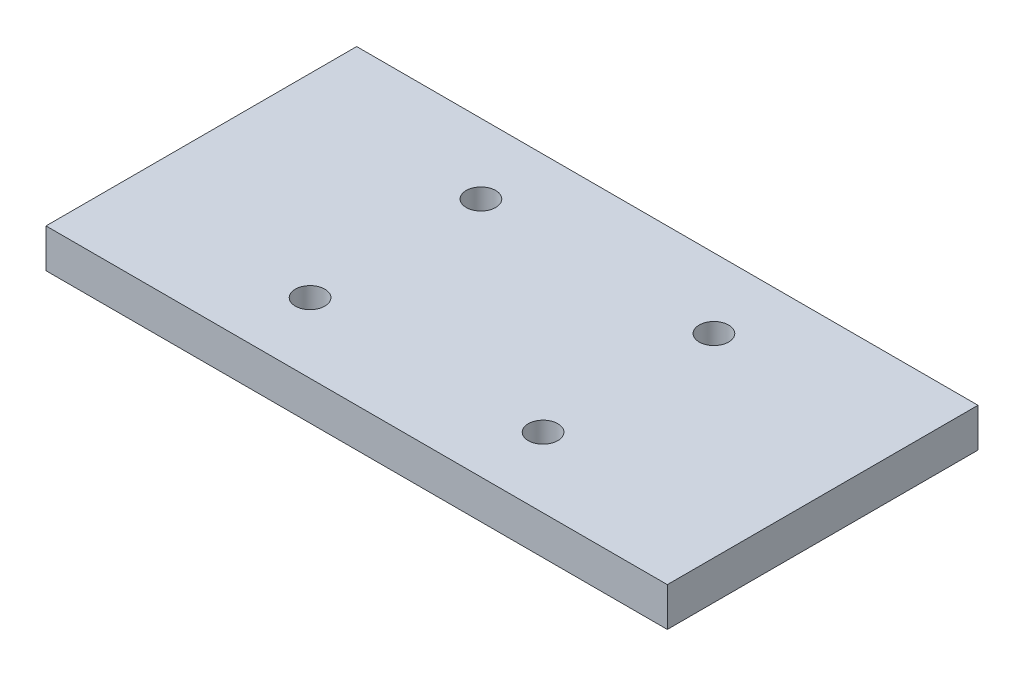
ISO-10303-21;
HEADER;
FILE_DESCRIPTION(('STEP AP214'),'2;1');
FILE_NAME('part.step','',(''),(''),'','','');
FILE_SCHEMA(('AUTOMOTIVE_DESIGN { 1 0 10303 214 1 1 1 1 }'));
ENDSEC;
DATA;
#1=APPLICATION_CONTEXT('core data for automotive mechanical design processes');
#2=APPLICATION_PROTOCOL_DEFINITION('international standard','automotive_design',2000,#1);
#3=PRODUCT_CONTEXT('',#1,'mechanical');
#4=PRODUCT('Part','Part','',(#3));
#5=PRODUCT_RELATED_PRODUCT_CATEGORY('part','',(#4));
#6=PRODUCT_DEFINITION_FORMATION('','',#4);
#7=PRODUCT_DEFINITION_CONTEXT('part definition',#1,'design');
#8=PRODUCT_DEFINITION('design','',#6,#7);
#9=PRODUCT_DEFINITION_SHAPE('','',#8);
#10=(LENGTH_UNIT() NAMED_UNIT(*) SI_UNIT(.MILLI.,.METRE.));
#11=(NAMED_UNIT(*) PLANE_ANGLE_UNIT() SI_UNIT($,.RADIAN.));
#12=(NAMED_UNIT(*) SI_UNIT($,.STERADIAN.) SOLID_ANGLE_UNIT());
#13=UNCERTAINTY_MEASURE_WITH_UNIT(LENGTH_MEASURE(1.E-05),#10,'distance_accuracy_value','');
#14=(GEOMETRIC_REPRESENTATION_CONTEXT(3) GLOBAL_UNCERTAINTY_ASSIGNED_CONTEXT((#13)) GLOBAL_UNIT_ASSIGNED_CONTEXT((#10,
#11,#12)) REPRESENTATION_CONTEXT('',''));
#15=CARTESIAN_POINT('',(0.,0.,0.));
#16=DIRECTION('',(0.,0.,1.));
#17=DIRECTION('',(1.,0.,0.));
#18=AXIS2_PLACEMENT_3D('',#15,#16,#17);
#19=CARTESIAN_POINT('',(50.8,6.35,25.4));
#20=DIRECTION('',(-1.,0.,0.));
#21=DIRECTION('',(0.,0.,1.));
#22=AXIS2_PLACEMENT_3D('',#19,#20,#21);
#23=PLANE('',#22);
#24=DIRECTION('',(0.,0.,-1.));
#25=VECTOR('',#24,1.);
#26=CARTESIAN_POINT('',(50.8,0.,25.4));
#27=LINE('',#26,#25);
#28=CARTESIAN_POINT('',(50.8,0.,25.4));
#29=VERTEX_POINT('',#28);
#30=CARTESIAN_POINT('',(50.8,0.,-25.4));
#31=VERTEX_POINT('',#30);
#32=EDGE_CURVE('E99',#29,#31,#27,.T.);
#33=ORIENTED_EDGE('',*,*,#32,.T.);
#34=DIRECTION('',(0.,-1.,0.));
#35=VECTOR('',#34,1.);
#36=CARTESIAN_POINT('',(50.8,6.35,-25.4));
#37=LINE('',#36,#35);
#38=CARTESIAN_POINT('',(50.8,6.35,-25.4));
#39=VERTEX_POINT('',#38);
#40=EDGE_CURVE('E11',#39,#31,#37,.T.);
#41=ORIENTED_EDGE('',*,*,#40,.F.);
#42=DIRECTION('',(0.,0.,-1.));
#43=VECTOR('',#42,1.);
#44=CARTESIAN_POINT('',(50.8,6.35,25.4));
#45=LINE('',#44,#43);
#46=CARTESIAN_POINT('',(50.8,6.35,25.4));
#47=VERTEX_POINT('',#46);
#48=EDGE_CURVE('E87',#47,#39,#45,.T.);
#49=ORIENTED_EDGE('',*,*,#48,.F.);
#50=DIRECTION('',(0.,-1.,0.));
#51=VECTOR('',#50,1.);
#52=CARTESIAN_POINT('',(50.8,6.35,25.4));
#53=LINE('',#52,#51);
#54=EDGE_CURVE('E95',#47,#29,#53,.T.);
#55=ORIENTED_EDGE('',*,*,#54,.T.);
#56=EDGE_LOOP('',(#33,#41,#49,#55));
#57=FACE_BOUND('',#56,.T.);
#58=ADVANCED_FACE('F36',(#57),#23,.F.);
#59=CARTESIAN_POINT('',(-50.8,6.35,-25.4));
#60=DIRECTION('',(0.,0.,1.));
#61=DIRECTION('',(1.,0.,0.));
#62=AXIS2_PLACEMENT_3D('',#59,#60,#61);
#63=PLANE('',#62);
#64=DIRECTION('',(-1.,0.,0.));
#65=VECTOR('',#64,1.);
#66=CARTESIAN_POINT('',(-50.8,0.,-25.4));
#67=LINE('',#66,#65);
#68=CARTESIAN_POINT('',(-50.8,0.,-25.4));
#69=VERTEX_POINT('',#68);
#70=EDGE_CURVE('E91',#31,#69,#67,.T.);
#71=ORIENTED_EDGE('',*,*,#70,.T.);
#72=DIRECTION('',(0.,-1.,0.));
#73=VECTOR('',#72,1.);
#74=CARTESIAN_POINT('',(-50.8,6.35,-25.4));
#75=LINE('',#74,#73);
#76=CARTESIAN_POINT('',(-50.8,6.35,-25.4));
#77=VERTEX_POINT('',#76);
#78=EDGE_CURVE('E44',#77,#69,#75,.T.);
#79=ORIENTED_EDGE('',*,*,#78,.F.);
#80=DIRECTION('',(-1.,0.,0.));
#81=VECTOR('',#80,1.);
#82=CARTESIAN_POINT('',(-50.8,6.35,-25.4));
#83=LINE('',#82,#81);
#84=EDGE_CURVE('E82',#39,#77,#83,.T.);
#85=ORIENTED_EDGE('',*,*,#84,.F.);
#86=ORIENTED_EDGE('',*,*,#40,.T.);
#87=EDGE_LOOP('',(#71,#79,#85,#86));
#88=FACE_BOUND('',#87,.T.);
#89=ADVANCED_FACE('F90',(#88),#63,.F.);
#90=CARTESIAN_POINT('',(-50.8,6.35,25.4));
#91=DIRECTION('',(1.,0.,0.));
#92=DIRECTION('',(0.,0.,-1.));
#93=AXIS2_PLACEMENT_3D('',#90,#91,#92);
#94=PLANE('',#93);
#95=DIRECTION('',(0.,0.,1.));
#96=VECTOR('',#95,1.);
#97=CARTESIAN_POINT('',(-50.8,0.,25.4));
#98=LINE('',#97,#96);
#99=CARTESIAN_POINT('',(-50.8,0.,25.4));
#100=VERTEX_POINT('',#99);
#101=EDGE_CURVE('E69',#69,#100,#98,.T.);
#102=ORIENTED_EDGE('',*,*,#101,.T.);
#103=DIRECTION('',(0.,-1.,0.));
#104=VECTOR('',#103,1.);
#105=CARTESIAN_POINT('',(-50.8,6.35,25.4));
#106=LINE('',#105,#104);
#107=CARTESIAN_POINT('',(-50.8,6.35,25.4));
#108=VERTEX_POINT('',#107);
#109=EDGE_CURVE('E92',#108,#100,#106,.T.);
#110=ORIENTED_EDGE('',*,*,#109,.F.);
#111=DIRECTION('',(0.,0.,1.));
#112=VECTOR('',#111,1.);
#113=CARTESIAN_POINT('',(-50.8,6.35,25.4));
#114=LINE('',#113,#112);
#115=EDGE_CURVE('E85',#77,#108,#114,.T.);
#116=ORIENTED_EDGE('',*,*,#115,.F.);
#117=ORIENTED_EDGE('',*,*,#78,.T.);
#118=EDGE_LOOP('',(#102,#110,#116,#117));
#119=FACE_BOUND('',#118,.T.);
#120=ADVANCED_FACE('F93',(#119),#94,.F.);
#121=CARTESIAN_POINT('',(-50.8,6.35,25.4));
#122=DIRECTION('',(0.,0.,-1.));
#123=DIRECTION('',(-1.,0.,0.));
#124=AXIS2_PLACEMENT_3D('',#121,#122,#123);
#125=PLANE('',#124);
#126=DIRECTION('',(1.,0.,0.));
#127=VECTOR('',#126,1.);
#128=CARTESIAN_POINT('',(-50.8,0.,25.4));
#129=LINE('',#128,#127);
#130=EDGE_CURVE('E75',#100,#29,#129,.T.);
#131=ORIENTED_EDGE('',*,*,#130,.T.);
#132=ORIENTED_EDGE('',*,*,#54,.F.);
#133=DIRECTION('',(1.,0.,0.));
#134=VECTOR('',#133,1.);
#135=CARTESIAN_POINT('',(-50.8,6.35,25.4));
#136=LINE('',#135,#134);
#137=EDGE_CURVE('E52',#108,#47,#136,.T.);
#138=ORIENTED_EDGE('',*,*,#137,.F.);
#139=ORIENTED_EDGE('',*,*,#109,.T.);
#140=EDGE_LOOP('',(#131,#132,#138,#139));
#141=FACE_BOUND('',#140,.T.);
#142=ADVANCED_FACE('F107',(#141),#125,.F.);
#143=CARTESIAN_POINT('',(0.,6.35,0.));
#144=DIRECTION('',(0.,-1.,0.));
#145=DIRECTION('',(0.,0.,-1.));
#146=AXIS2_PLACEMENT_3D('',#143,#144,#145);
#147=PLANE('',#146);
#148=CARTESIAN_POINT('',(-19.05,6.35,13.97));
#149=DIRECTION('',(0.,-1.,0.));
#150=DIRECTION('',(0.,0.,-1.));
#151=AXIS2_PLACEMENT_3D('',#148,#149,#150);
#152=CIRCLE('',#151,2.413);
#153=CARTESIAN_POINT('',(-19.05,6.35,11.557));
#154=VERTEX_POINT('',#153);
#155=EDGE_CURVE('E139',#154,#154,#152,.T.);
#156=ORIENTED_EDGE('',*,*,#155,.T.);
#157=EDGE_LOOP('',(#156));
#158=FACE_BOUND('',#157,.T.);
#159=CARTESIAN_POINT('',(19.05,6.35,13.97));
#160=DIRECTION('',(0.,-1.,0.));
#161=DIRECTION('',(0.,0.,-1.));
#162=AXIS2_PLACEMENT_3D('',#159,#160,#161);
#163=CIRCLE('',#162,2.413);
#164=CARTESIAN_POINT('',(19.05,6.35,11.557));
#165=VERTEX_POINT('',#164);
#166=EDGE_CURVE('E130',#165,#165,#163,.T.);
#167=ORIENTED_EDGE('',*,*,#166,.T.);
#168=EDGE_LOOP('',(#167));
#169=FACE_BOUND('',#168,.T.);
#170=CARTESIAN_POINT('',(19.05,6.35,-13.97));
#171=DIRECTION('',(0.,-1.,0.));
#172=DIRECTION('',(0.,0.,-1.));
#173=AXIS2_PLACEMENT_3D('',#170,#171,#172);
#174=CIRCLE('',#173,2.413);
#175=CARTESIAN_POINT('',(19.05,6.35,-16.383));
#176=VERTEX_POINT('',#175);
#177=EDGE_CURVE('E121',#176,#176,#174,.T.);
#178=ORIENTED_EDGE('',*,*,#177,.T.);
#179=EDGE_LOOP('',(#178));
#180=FACE_BOUND('',#179,.T.);
#181=CARTESIAN_POINT('',(-19.05,6.35,-13.97));
#182=DIRECTION('',(0.,-1.,0.));
#183=DIRECTION('',(0.,0.,-1.));
#184=AXIS2_PLACEMENT_3D('',#181,#182,#183);
#185=CIRCLE('',#184,2.413);
#186=CARTESIAN_POINT('',(-19.05,6.35,-16.383));
#187=VERTEX_POINT('',#186);
#188=EDGE_CURVE('E102',#187,#187,#185,.T.);
#189=ORIENTED_EDGE('',*,*,#188,.T.);
#190=EDGE_LOOP('',(#189));
#191=FACE_BOUND('',#190,.T.);
#192=ORIENTED_EDGE('',*,*,#48,.T.);
#193=ORIENTED_EDGE('',*,*,#84,.T.);
#194=ORIENTED_EDGE('',*,*,#115,.T.);
#195=ORIENTED_EDGE('',*,*,#137,.T.);
#196=EDGE_LOOP('',(#192,#193,#194,#195));
#197=FACE_BOUND('',#196,.T.);
#198=ADVANCED_FACE('F83',(#158,#169,#180,#191,#197),#147,.F.);
#199=CARTESIAN_POINT('',(0.,0.,0.));
#200=DIRECTION('',(0.,-1.,0.));
#201=DIRECTION('',(0.,0.,-1.));
#202=AXIS2_PLACEMENT_3D('',#199,#200,#201);
#203=PLANE('',#202);
#204=CARTESIAN_POINT('',(-19.05,0.,13.97));
#205=DIRECTION('',(0.,-1.,0.));
#206=DIRECTION('',(0.,0.,-1.));
#207=AXIS2_PLACEMENT_3D('',#204,#205,#206);
#208=CIRCLE('',#207,4.7625);
#209=CARTESIAN_POINT('',(-19.05,0.,9.2075));
#210=VERTEX_POINT('',#209);
#211=EDGE_CURVE('E145',#210,#210,#208,.T.);
#212=ORIENTED_EDGE('',*,*,#211,.F.);
#213=EDGE_LOOP('',(#212));
#214=FACE_BOUND('',#213,.T.);
#215=CARTESIAN_POINT('',(19.05,0.,13.97));
#216=DIRECTION('',(0.,-1.,0.));
#217=DIRECTION('',(0.,0.,-1.));
#218=AXIS2_PLACEMENT_3D('',#215,#216,#217);
#219=CIRCLE('',#218,4.7625);
#220=CARTESIAN_POINT('',(19.05,0.,9.2075));
#221=VERTEX_POINT('',#220);
#222=EDGE_CURVE('E136',#221,#221,#219,.T.);
#223=ORIENTED_EDGE('',*,*,#222,.F.);
#224=EDGE_LOOP('',(#223));
#225=FACE_BOUND('',#224,.T.);
#226=CARTESIAN_POINT('',(19.05,0.,-13.97));
#227=DIRECTION('',(0.,-1.,0.));
#228=DIRECTION('',(0.,0.,-1.));
#229=AXIS2_PLACEMENT_3D('',#226,#227,#228);
#230=CIRCLE('',#229,4.7625);
#231=CARTESIAN_POINT('',(19.05,0.,-18.7325));
#232=VERTEX_POINT('',#231);
#233=EDGE_CURVE('E127',#232,#232,#230,.T.);
#234=ORIENTED_EDGE('',*,*,#233,.F.);
#235=EDGE_LOOP('',(#234));
#236=FACE_BOUND('',#235,.T.);
#237=CARTESIAN_POINT('',(-19.05,0.,-13.97));
#238=DIRECTION('',(0.,-1.,0.));
#239=DIRECTION('',(0.,0.,-1.));
#240=AXIS2_PLACEMENT_3D('',#237,#238,#239);
#241=CIRCLE('',#240,4.7625);
#242=CARTESIAN_POINT('',(-19.05,0.,-18.7325));
#243=VERTEX_POINT('',#242);
#244=EDGE_CURVE('E118',#243,#243,#241,.T.);
#245=ORIENTED_EDGE('',*,*,#244,.F.);
#246=EDGE_LOOP('',(#245));
#247=FACE_BOUND('',#246,.T.);
#248=ORIENTED_EDGE('',*,*,#32,.F.);
#249=ORIENTED_EDGE('',*,*,#130,.F.);
#250=ORIENTED_EDGE('',*,*,#101,.F.);
#251=ORIENTED_EDGE('',*,*,#70,.F.);
#252=EDGE_LOOP('',(#248,#249,#250,#251));
#253=FACE_BOUND('',#252,.T.);
#254=ADVANCED_FACE('F110',(#214,#225,#236,#247,#253),#203,.T.);
#255=CARTESIAN_POINT('',(-19.05,0.,-13.97));
#256=DIRECTION('',(0.,-1.,0.));
#257=DIRECTION('',(0.,0.,-1.));
#258=AXIS2_PLACEMENT_3D('',#255,#256,#257);
#259=CYLINDRICAL_SURFACE('',#258,2.413);
#260=ORIENTED_EDGE('',*,*,#188,.F.);
#261=EDGE_LOOP('',(#260));
#262=FACE_BOUND('',#261,.T.);
#263=CARTESIAN_POINT('',(-19.05,2.70279057276576,-13.97));
#264=DIRECTION('',(0.,-1.,0.));
#265=DIRECTION('',(0.,0.,-1.));
#266=AXIS2_PLACEMENT_3D('',#263,#264,#265);
#267=CIRCLE('',#266,2.413);
#268=CARTESIAN_POINT('',(-19.05,2.70279057276576,-16.383));
#269=VERTEX_POINT('',#268);
#270=EDGE_CURVE('E115',#269,#269,#267,.T.);
#271=ORIENTED_EDGE('',*,*,#270,.T.);
#272=EDGE_LOOP('',(#271));
#273=FACE_BOUND('',#272,.T.);
#274=ADVANCED_FACE('F153',(#262,#273),#259,.F.);
#275=CARTESIAN_POINT('',(-19.05,0.,-13.97));
#276=DIRECTION('',(0.,-1.,0.));
#277=DIRECTION('',(0.,0.,-1.));
#278=AXIS2_PLACEMENT_3D('',#275,#276,#277);
#279=CONICAL_SURFACE('',#278,4.7625,0.715584993317675);
#280=ORIENTED_EDGE('',*,*,#270,.F.);
#281=EDGE_LOOP('',(#280));
#282=FACE_BOUND('',#281,.T.);
#283=ORIENTED_EDGE('',*,*,#244,.T.);
#284=EDGE_LOOP('',(#283));
#285=FACE_BOUND('',#284,.T.);
#286=ADVANCED_FACE('F161',(#282,#285),#279,.F.);
#287=CARTESIAN_POINT('',(19.05,0.,-13.97));
#288=DIRECTION('',(0.,-1.,0.));
#289=DIRECTION('',(0.,0.,-1.));
#290=AXIS2_PLACEMENT_3D('',#287,#288,#289);
#291=CYLINDRICAL_SURFACE('',#290,2.413);
#292=ORIENTED_EDGE('',*,*,#177,.F.);
#293=EDGE_LOOP('',(#292));
#294=FACE_BOUND('',#293,.T.);
#295=CARTESIAN_POINT('',(19.05,2.70279057276576,-13.97));
#296=DIRECTION('',(0.,-1.,0.));
#297=DIRECTION('',(0.,0.,-1.));
#298=AXIS2_PLACEMENT_3D('',#295,#296,#297);
#299=CIRCLE('',#298,2.413);
#300=CARTESIAN_POINT('',(19.05,2.70279057276576,-16.383));
#301=VERTEX_POINT('',#300);
#302=EDGE_CURVE('E124',#301,#301,#299,.T.);
#303=ORIENTED_EDGE('',*,*,#302,.T.);
#304=EDGE_LOOP('',(#303));
#305=FACE_BOUND('',#304,.T.);
#306=ADVANCED_FACE('F163',(#294,#305),#291,.F.);
#307=CARTESIAN_POINT('',(19.05,0.,-13.97));
#308=DIRECTION('',(0.,-1.,0.));
#309=DIRECTION('',(0.,0.,-1.));
#310=AXIS2_PLACEMENT_3D('',#307,#308,#309);
#311=CONICAL_SURFACE('',#310,4.7625,0.715584993317675);
#312=ORIENTED_EDGE('',*,*,#302,.F.);
#313=EDGE_LOOP('',(#312));
#314=FACE_BOUND('',#313,.T.);
#315=ORIENTED_EDGE('',*,*,#233,.T.);
#316=EDGE_LOOP('',(#315));
#317=FACE_BOUND('',#316,.T.);
#318=ADVANCED_FACE('F170',(#314,#317),#311,.F.);
#319=CARTESIAN_POINT('',(19.05,0.,13.97));
#320=DIRECTION('',(0.,-1.,0.));
#321=DIRECTION('',(0.,0.,-1.));
#322=AXIS2_PLACEMENT_3D('',#319,#320,#321);
#323=CYLINDRICAL_SURFACE('',#322,2.413);
#324=ORIENTED_EDGE('',*,*,#166,.F.);
#325=EDGE_LOOP('',(#324));
#326=FACE_BOUND('',#325,.T.);
#327=CARTESIAN_POINT('',(19.05,2.70279057276576,13.97));
#328=DIRECTION('',(0.,-1.,0.));
#329=DIRECTION('',(0.,0.,-1.));
#330=AXIS2_PLACEMENT_3D('',#327,#328,#329);
#331=CIRCLE('',#330,2.413);
#332=CARTESIAN_POINT('',(19.05,2.70279057276576,11.557));
#333=VERTEX_POINT('',#332);
#334=EDGE_CURVE('E133',#333,#333,#331,.T.);
#335=ORIENTED_EDGE('',*,*,#334,.T.);
#336=EDGE_LOOP('',(#335));
#337=FACE_BOUND('',#336,.T.);
#338=ADVANCED_FACE('F204',(#326,#337),#323,.F.);
#339=CARTESIAN_POINT('',(19.05,0.,13.97));
#340=DIRECTION('',(0.,-1.,0.));
#341=DIRECTION('',(0.,0.,-1.));
#342=AXIS2_PLACEMENT_3D('',#339,#340,#341);
#343=CONICAL_SURFACE('',#342,4.7625,0.715584993317675);
#344=ORIENTED_EDGE('',*,*,#334,.F.);
#345=EDGE_LOOP('',(#344));
#346=FACE_BOUND('',#345,.T.);
#347=ORIENTED_EDGE('',*,*,#222,.T.);
#348=EDGE_LOOP('',(#347));
#349=FACE_BOUND('',#348,.T.);
#350=ADVANCED_FACE('F209',(#346,#349),#343,.F.);
#351=CARTESIAN_POINT('',(-19.05,0.,13.97));
#352=DIRECTION('',(0.,-1.,0.));
#353=DIRECTION('',(0.,0.,-1.));
#354=AXIS2_PLACEMENT_3D('',#351,#352,#353);
#355=CYLINDRICAL_SURFACE('',#354,2.413);
#356=ORIENTED_EDGE('',*,*,#155,.F.);
#357=EDGE_LOOP('',(#356));
#358=FACE_BOUND('',#357,.T.);
#359=CARTESIAN_POINT('',(-19.05,2.70279057276576,13.97));
#360=DIRECTION('',(0.,-1.,0.));
#361=DIRECTION('',(0.,0.,-1.));
#362=AXIS2_PLACEMENT_3D('',#359,#360,#361);
#363=CIRCLE('',#362,2.413);
#364=CARTESIAN_POINT('',(-19.05,2.70279057276576,11.557));
#365=VERTEX_POINT('',#364);
#366=EDGE_CURVE('E142',#365,#365,#363,.T.);
#367=ORIENTED_EDGE('',*,*,#366,.T.);
#368=EDGE_LOOP('',(#367));
#369=FACE_BOUND('',#368,.T.);
#370=ADVANCED_FACE('F215',(#358,#369),#355,.F.);
#371=CARTESIAN_POINT('',(-19.05,0.,13.97));
#372=DIRECTION('',(0.,-1.,0.));
#373=DIRECTION('',(0.,0.,-1.));
#374=AXIS2_PLACEMENT_3D('',#371,#372,#373);
#375=CONICAL_SURFACE('',#374,4.7625,0.715584993317675);
#376=ORIENTED_EDGE('',*,*,#366,.F.);
#377=EDGE_LOOP('',(#376));
#378=FACE_BOUND('',#377,.T.);
#379=ORIENTED_EDGE('',*,*,#211,.T.);
#380=EDGE_LOOP('',(#379));
#381=FACE_BOUND('',#380,.T.);
#382=ADVANCED_FACE('F149',(#378,#381),#375,.F.);
#383=CLOSED_SHELL('',(#58,#89,#120,#142,#198,#254,#274,#286,#306,#318,#338,#350,#370,#382));
#384=MANIFOLD_SOLID_BREP('B2',#383);
#385=ADVANCED_BREP_SHAPE_REPRESENTATION('',(#18,#384),#14);
#386=SHAPE_DEFINITION_REPRESENTATION(#9,#385);
ENDSEC;
END-ISO-10303-21;
